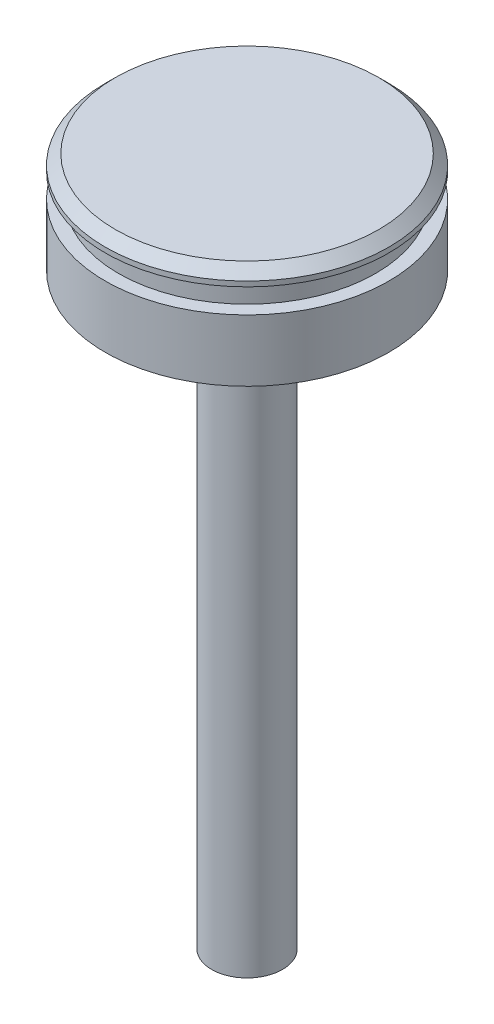
ISO-10303-21;
HEADER;
FILE_DESCRIPTION(('STEP AP214'),'2;1');
FILE_NAME('part.step','',(''),(''),'','','');
FILE_SCHEMA(('AUTOMOTIVE_DESIGN { 1 0 10303 214 1 1 1 1 }'));
ENDSEC;
DATA;
#1=APPLICATION_CONTEXT('core data for automotive mechanical design processes');
#2=APPLICATION_PROTOCOL_DEFINITION('international standard','automotive_design',2000,#1);
#3=PRODUCT_CONTEXT('',#1,'mechanical');
#4=PRODUCT('Part','Part','',(#3));
#5=PRODUCT_RELATED_PRODUCT_CATEGORY('part','',(#4));
#6=PRODUCT_DEFINITION_FORMATION('','',#4);
#7=PRODUCT_DEFINITION_CONTEXT('part definition',#1,'design');
#8=PRODUCT_DEFINITION('design','',#6,#7);
#9=PRODUCT_DEFINITION_SHAPE('','',#8);
#10=(LENGTH_UNIT() NAMED_UNIT(*) SI_UNIT(.MILLI.,.METRE.));
#11=(NAMED_UNIT(*) PLANE_ANGLE_UNIT() SI_UNIT($,.RADIAN.));
#12=(NAMED_UNIT(*) SI_UNIT($,.STERADIAN.) SOLID_ANGLE_UNIT());
#13=UNCERTAINTY_MEASURE_WITH_UNIT(LENGTH_MEASURE(1.E-05),#10,'distance_accuracy_value','');
#14=(GEOMETRIC_REPRESENTATION_CONTEXT(3) GLOBAL_UNCERTAINTY_ASSIGNED_CONTEXT((#13)) GLOBAL_UNIT_ASSIGNED_CONTEXT((#10,
#11,#12)) REPRESENTATION_CONTEXT('',''));
#15=CARTESIAN_POINT('',(0.,0.,0.));
#16=DIRECTION('',(0.,0.,1.));
#17=DIRECTION('',(1.,0.,0.));
#18=AXIS2_PLACEMENT_3D('',#15,#16,#17);
#19=CARTESIAN_POINT('',(0.,0.,0.));
#20=DIRECTION('',(0.,-1.,0.));
#21=DIRECTION('',(0.,0.,-1.));
#22=AXIS2_PLACEMENT_3D('',#19,#20,#21);
#23=CYLINDRICAL_SURFACE('',#22,12.7);
#24=CARTESIAN_POINT('',(0.,64.1,0.));
#25=DIRECTION('',(0.,-1.,0.));
#26=DIRECTION('',(0.,0.,-1.));
#27=AXIS2_PLACEMENT_3D('',#24,#25,#26);
#28=CIRCLE('',#27,12.7);
#29=CARTESIAN_POINT('',(0.,64.1,-12.7));
#30=VERTEX_POINT('',#29);
#31=EDGE_CURVE('E53',#30,#30,#28,.T.);
#32=ORIENTED_EDGE('',*,*,#31,.F.);
#33=EDGE_LOOP('',(#32));
#34=FACE_BOUND('',#33,.T.);
#35=CARTESIAN_POINT('',(0.,66.5,0.));
#36=DIRECTION('',(0.,-1.,0.));
#37=DIRECTION('',(0.,0.,-1.));
#38=AXIS2_PLACEMENT_3D('',#35,#36,#37);
#39=CIRCLE('',#38,12.7);
#40=CARTESIAN_POINT('',(0.,66.5,-12.7));
#41=VERTEX_POINT('',#40);
#42=EDGE_CURVE('E74',#41,#41,#39,.T.);
#43=ORIENTED_EDGE('',*,*,#42,.T.);
#44=EDGE_LOOP('',(#43));
#45=FACE_BOUND('',#44,.T.);
#46=ADVANCED_FACE('F41',(#34,#45),#23,.T.);
#47=CARTESIAN_POINT('',(0.,64.1,0.));
#48=DIRECTION('',(0.,-1.,0.));
#49=DIRECTION('',(0.,0.,-1.));
#50=AXIS2_PLACEMENT_3D('',#47,#48,#49);
#51=PLANE('',#50);
#52=CARTESIAN_POINT('',(0.,64.1,0.));
#53=DIRECTION('',(0.,-1.,0.));
#54=DIRECTION('',(0.,0.,-1.));
#55=AXIS2_PLACEMENT_3D('',#52,#53,#54);
#56=CIRCLE('',#55,14.);
#57=CARTESIAN_POINT('',(0.,64.1,-14.));
#58=VERTEX_POINT('',#57);
#59=EDGE_CURVE('E57',#58,#58,#56,.T.);
#60=ORIENTED_EDGE('',*,*,#59,.F.);
#61=EDGE_LOOP('',(#60));
#62=FACE_BOUND('',#61,.T.);
#63=ORIENTED_EDGE('',*,*,#31,.T.);
#64=EDGE_LOOP('',(#63));
#65=FACE_BOUND('',#64,.T.);
#66=ADVANCED_FACE('F97',(#62,#65),#51,.F.);
#67=CARTESIAN_POINT('',(0.,0.,0.));
#68=DIRECTION('',(0.,-1.,0.));
#69=DIRECTION('',(0.,0.,-1.));
#70=AXIS2_PLACEMENT_3D('',#67,#68,#69);
#71=CYLINDRICAL_SURFACE('',#70,14.);
#72=ORIENTED_EDGE('',*,*,#59,.T.);
#73=EDGE_LOOP('',(#72));
#74=FACE_BOUND('',#73,.T.);
#75=CARTESIAN_POINT('',(0.,58.,0.));
#76=DIRECTION('',(0.,-1.,0.));
#77=DIRECTION('',(0.,0.,-1.));
#78=AXIS2_PLACEMENT_3D('',#75,#76,#77);
#79=CIRCLE('',#78,14.);
#80=CARTESIAN_POINT('',(0.,58.,-14.));
#81=VERTEX_POINT('',#80);
#82=EDGE_CURVE('E62',#81,#81,#79,.T.);
#83=ORIENTED_EDGE('',*,*,#82,.F.);
#84=EDGE_LOOP('',(#83));
#85=FACE_BOUND('',#84,.T.);
#86=ADVANCED_FACE('F89',(#74,#85),#71,.T.);
#87=CARTESIAN_POINT('',(0.,58.,0.));
#88=DIRECTION('',(0.,-1.,0.));
#89=DIRECTION('',(0.,0.,-1.));
#90=AXIS2_PLACEMENT_3D('',#87,#88,#89);
#91=PLANE('',#90);
#92=ORIENTED_EDGE('',*,*,#82,.T.);
#93=EDGE_LOOP('',(#92));
#94=FACE_BOUND('',#93,.T.);
#95=CARTESIAN_POINT('',(0.,58.,0.));
#96=DIRECTION('',(0.,-1.,0.));
#97=DIRECTION('',(0.,0.,-1.));
#98=AXIS2_PLACEMENT_3D('',#95,#96,#97);
#99=CIRCLE('',#98,3.5);
#100=CARTESIAN_POINT('',(0.,58.,-3.5));
#101=VERTEX_POINT('',#100);
#102=EDGE_CURVE('E65',#101,#101,#99,.T.);
#103=ORIENTED_EDGE('',*,*,#102,.F.);
#104=EDGE_LOOP('',(#103));
#105=FACE_BOUND('',#104,.T.);
#106=ADVANCED_FACE('F96',(#94,#105),#91,.T.);
#107=CARTESIAN_POINT('',(0.,0.,0.));
#108=DIRECTION('',(0.,-1.,0.));
#109=DIRECTION('',(0.,0.,-1.));
#110=AXIS2_PLACEMENT_3D('',#107,#108,#109);
#111=CYLINDRICAL_SURFACE('',#110,3.5);
#112=ORIENTED_EDGE('',*,*,#102,.T.);
#113=EDGE_LOOP('',(#112));
#114=FACE_BOUND('',#113,.T.);
#115=CARTESIAN_POINT('',(0.,0.,0.));
#116=DIRECTION('',(0.,-1.,0.));
#117=DIRECTION('',(0.,0.,-1.));
#118=AXIS2_PLACEMENT_3D('',#115,#116,#117);
#119=CIRCLE('',#118,3.5);
#120=CARTESIAN_POINT('',(0.,0.,-3.5));
#121=VERTEX_POINT('',#120);
#122=EDGE_CURVE('E68',#121,#121,#119,.T.);
#123=ORIENTED_EDGE('',*,*,#122,.F.);
#124=EDGE_LOOP('',(#123));
#125=FACE_BOUND('',#124,.T.);
#126=ADVANCED_FACE('F110',(#114,#125),#111,.T.);
#127=CARTESIAN_POINT('',(0.,0.,0.));
#128=DIRECTION('',(0.,-1.,0.));
#129=DIRECTION('',(0.,0.,-1.));
#130=AXIS2_PLACEMENT_3D('',#127,#128,#129);
#131=PLANE('',#130);
#132=ORIENTED_EDGE('',*,*,#122,.T.);
#133=EDGE_LOOP('',(#132));
#134=FACE_BOUND('',#133,.T.);
#135=ADVANCED_FACE('F93',(#134),#131,.T.);
#136=CARTESIAN_POINT('',(0.,68.,0.));
#137=DIRECTION('',(0.,1.,0.));
#138=DIRECTION('',(0.,0.,1.));
#139=AXIS2_PLACEMENT_3D('',#136,#137,#138);
#140=PLANE('',#139);
#141=CARTESIAN_POINT('',(0.,68.,0.));
#142=DIRECTION('',(0.,1.,0.));
#143=DIRECTION('',(0.,0.,1.));
#144=AXIS2_PLACEMENT_3D('',#141,#142,#143);
#145=CIRCLE('',#144,13.);
#146=CARTESIAN_POINT('',(0.,68.,13.));
#147=VERTEX_POINT('',#146);
#148=EDGE_CURVE('E10',#147,#147,#145,.T.);
#149=ORIENTED_EDGE('',*,*,#148,.T.);
#150=EDGE_LOOP('',(#149));
#151=FACE_BOUND('',#150,.T.);
#152=ADVANCED_FACE('F87',(#151),#140,.T.);
#153=CARTESIAN_POINT('',(0.,67.,0.));
#154=DIRECTION('',(0.,1.,0.));
#155=DIRECTION('',(0.,0.,1.));
#156=AXIS2_PLACEMENT_3D('',#153,#154,#155);
#157=CIRCLE('',#156,14.);
#158=CARTESIAN_POINT('',(0.,67.,14.));
#159=VERTEX_POINT('',#158);
#160=EDGE_CURVE('E49',#159,#159,#157,.F.);
#161=ORIENTED_EDGE('',*,*,#160,.T.);
#162=EDGE_LOOP('',(#161));
#163=FACE_BOUND('',#162,.T.);
#164=CARTESIAN_POINT('',(0.,66.5,0.));
#165=DIRECTION('',(0.,-1.,0.));
#166=DIRECTION('',(0.,0.,-1.));
#167=AXIS2_PLACEMENT_3D('',#164,#165,#166);
#168=CIRCLE('',#167,14.);
#169=CARTESIAN_POINT('',(0.,66.5,-14.));
#170=VERTEX_POINT('',#169);
#171=EDGE_CURVE('E71',#170,#170,#168,.T.);
#172=ORIENTED_EDGE('',*,*,#171,.F.);
#173=EDGE_LOOP('',(#172));
#174=FACE_BOUND('',#173,.T.);
#175=ADVANCED_FACE('F82',(#163,#174),#71,.T.);
#176=CARTESIAN_POINT('',(0.,66.5,0.));
#177=DIRECTION('',(0.,1.,0.));
#178=DIRECTION('',(0.,0.,1.));
#179=AXIS2_PLACEMENT_3D('',#176,#177,#178);
#180=PLANE('',#179);
#181=ORIENTED_EDGE('',*,*,#42,.F.);
#182=EDGE_LOOP('',(#181));
#183=FACE_BOUND('',#182,.T.);
#184=ORIENTED_EDGE('',*,*,#171,.T.);
#185=EDGE_LOOP('',(#184));
#186=FACE_BOUND('',#185,.T.);
#187=ADVANCED_FACE('F79',(#183,#186),#180,.F.);
#188=CARTESIAN_POINT('',(0.,67.,0.));
#189=DIRECTION('',(0.,-1.,0.));
#190=DIRECTION('',(0.,0.,-1.));
#191=AXIS2_PLACEMENT_3D('',#188,#189,#190);
#192=CONICAL_SURFACE('',#191,14.,0.785398163397437);
#193=ORIENTED_EDGE('',*,*,#148,.F.);
#194=EDGE_LOOP('',(#193));
#195=FACE_BOUND('',#194,.T.);
#196=ORIENTED_EDGE('',*,*,#160,.F.);
#197=EDGE_LOOP('',(#196));
#198=FACE_BOUND('',#197,.T.);
#199=ADVANCED_FACE('F44',(#195,#198),#192,.T.);
#200=CLOSED_SHELL('',(#46,#66,#86,#106,#126,#135,#152,#175,#187,#199));
#201=MANIFOLD_SOLID_BREP('B2',#200);
#202=ADVANCED_BREP_SHAPE_REPRESENTATION('',(#18,#201),#14);
#203=SHAPE_DEFINITION_REPRESENTATION(#9,#202);
ENDSEC;
END-ISO-10303-21;
